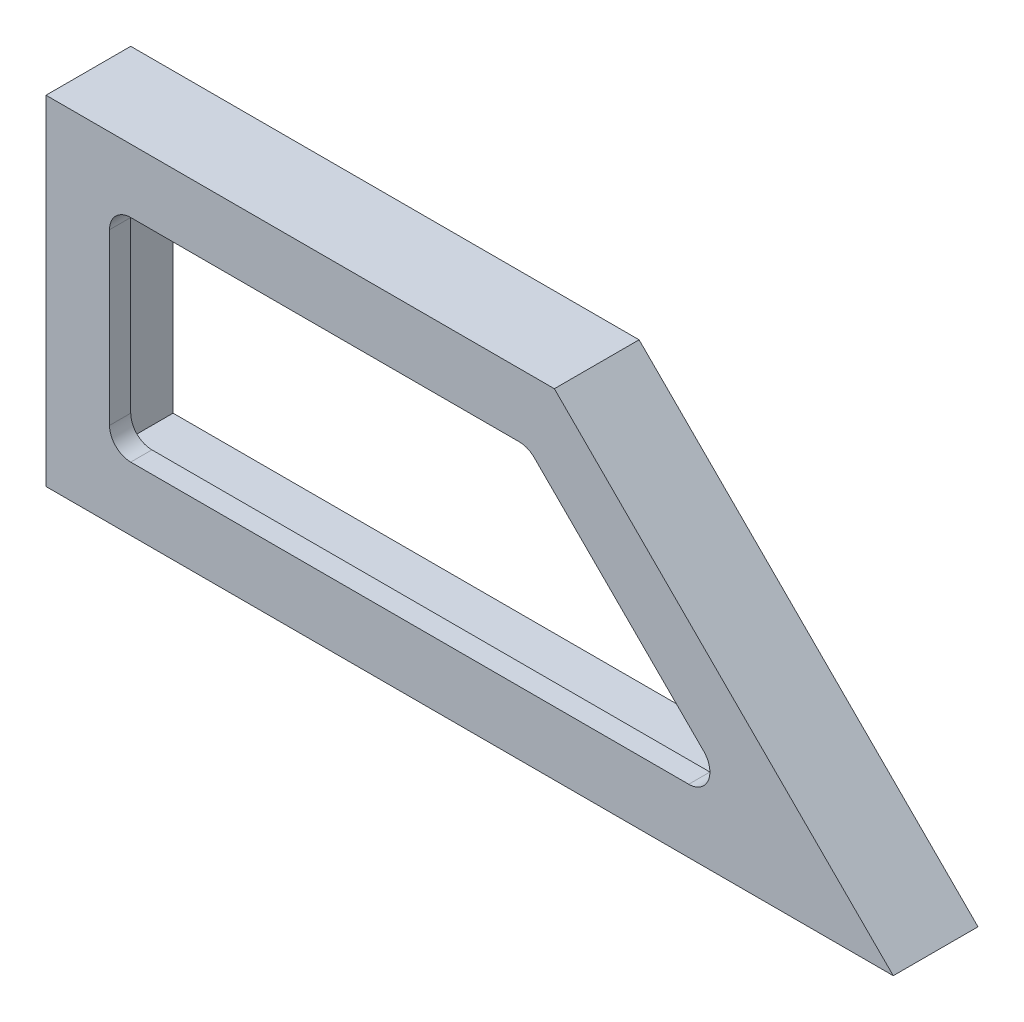
ISO-10303-21;
HEADER;
FILE_DESCRIPTION(('STEP AP214'),'2;1');
FILE_NAME('part.step','',(''),(''),'','','');
FILE_SCHEMA(('AUTOMOTIVE_DESIGN { 1 0 10303 214 1 1 1 1 }'));
ENDSEC;
DATA;
#1=APPLICATION_CONTEXT('core data for automotive mechanical design processes');
#2=APPLICATION_PROTOCOL_DEFINITION('international standard','automotive_design',2000,#1);
#3=PRODUCT_CONTEXT('',#1,'mechanical');
#4=PRODUCT('Part','Part','',(#3));
#5=PRODUCT_RELATED_PRODUCT_CATEGORY('part','',(#4));
#6=PRODUCT_DEFINITION_FORMATION('','',#4);
#7=PRODUCT_DEFINITION_CONTEXT('part definition',#1,'design');
#8=PRODUCT_DEFINITION('design','',#6,#7);
#9=PRODUCT_DEFINITION_SHAPE('','',#8);
#10=(LENGTH_UNIT() NAMED_UNIT(*) SI_UNIT(.MILLI.,.METRE.));
#11=(NAMED_UNIT(*) PLANE_ANGLE_UNIT() SI_UNIT($,.RADIAN.));
#12=(NAMED_UNIT(*) SI_UNIT($,.STERADIAN.) SOLID_ANGLE_UNIT());
#13=UNCERTAINTY_MEASURE_WITH_UNIT(LENGTH_MEASURE(1.E-05),#10,'distance_accuracy_value','');
#14=(GEOMETRIC_REPRESENTATION_CONTEXT(3) GLOBAL_UNCERTAINTY_ASSIGNED_CONTEXT((#13)) GLOBAL_UNIT_ASSIGNED_CONTEXT((#10,
#11,#12)) REPRESENTATION_CONTEXT('',''));
#15=CARTESIAN_POINT('',(0.,0.,0.));
#16=DIRECTION('',(0.,0.,1.));
#17=DIRECTION('',(1.,0.,0.));
#18=AXIS2_PLACEMENT_3D('',#15,#16,#17);
#19=CARTESIAN_POINT('',(0.,8.,2.));
#20=DIRECTION('',(-0.707106781186548,-0.707106781186547,0.));
#21=DIRECTION('',(0.707106781186547,-0.707106781186548,0.));
#22=AXIS2_PLACEMENT_3D('',#19,#20,#21);
#23=PLANE('',#22);
#24=DIRECTION('',(-0.707106781186547,0.707106781186548,0.));
#25=VECTOR('',#24,1.);
#26=CARTESIAN_POINT('',(0.,8.,0.));
#27=LINE('',#26,#25);
#28=CARTESIAN_POINT('',(8.,0.,0.));
#29=VERTEX_POINT('',#28);
#30=CARTESIAN_POINT('',(0.,8.,0.));
#31=VERTEX_POINT('',#30);
#32=EDGE_CURVE('E209',#29,#31,#27,.T.);
#33=ORIENTED_EDGE('',*,*,#32,.T.);
#34=DIRECTION('',(0.,0.,-1.));
#35=VECTOR('',#34,1.);
#36=CARTESIAN_POINT('',(0.,8.,2.));
#37=LINE('',#36,#35);
#38=CARTESIAN_POINT('',(0.,8.,2.));
#39=VERTEX_POINT('',#38);
#40=EDGE_CURVE('E233',#39,#31,#37,.T.);
#41=ORIENTED_EDGE('',*,*,#40,.F.);
#42=DIRECTION('',(-0.707106781186547,0.707106781186548,0.));
#43=VECTOR('',#42,1.);
#44=CARTESIAN_POINT('',(0.,8.,2.));
#45=LINE('',#44,#43);
#46=CARTESIAN_POINT('',(8.,0.,2.));
#47=VERTEX_POINT('',#46);
#48=EDGE_CURVE('E213',#47,#39,#45,.T.);
#49=ORIENTED_EDGE('',*,*,#48,.F.);
#50=DIRECTION('',(0.,0.,-1.));
#51=VECTOR('',#50,1.);
#52=CARTESIAN_POINT('',(8.,0.,2.));
#53=LINE('',#52,#51);
#54=EDGE_CURVE('E236',#47,#29,#53,.T.);
#55=ORIENTED_EDGE('',*,*,#54,.T.);
#56=EDGE_LOOP('',(#33,#41,#49,#55));
#57=FACE_BOUND('',#56,.T.);
#58=ADVANCED_FACE('F33',(#57),#23,.F.);
#59=CARTESIAN_POINT('',(0.,8.,2.));
#60=DIRECTION('',(0.,-1.,0.));
#61=DIRECTION('',(1.,0.,0.));
#62=AXIS2_PLACEMENT_3D('',#59,#60,#61);
#63=PLANE('',#62);
#64=DIRECTION('',(-1.,0.,0.));
#65=VECTOR('',#64,1.);
#66=CARTESIAN_POINT('',(0.,8.,0.));
#67=LINE('',#66,#65);
#68=CARTESIAN_POINT('',(-12.,8.,0.));
#69=VERTEX_POINT('',#68);
#70=EDGE_CURVE('E223',#31,#69,#67,.T.);
#71=ORIENTED_EDGE('',*,*,#70,.T.);
#72=DIRECTION('',(0.,0.,-1.));
#73=VECTOR('',#72,1.);
#74=CARTESIAN_POINT('',(-12.,8.,2.));
#75=LINE('',#74,#73);
#76=CARTESIAN_POINT('',(-12.,8.,2.));
#77=VERTEX_POINT('',#76);
#78=EDGE_CURVE('E230',#77,#69,#75,.T.);
#79=ORIENTED_EDGE('',*,*,#78,.F.);
#80=DIRECTION('',(-1.,0.,0.));
#81=VECTOR('',#80,1.);
#82=CARTESIAN_POINT('',(0.,8.,2.));
#83=LINE('',#82,#81);
#84=EDGE_CURVE('E216',#39,#77,#83,.T.);
#85=ORIENTED_EDGE('',*,*,#84,.F.);
#86=ORIENTED_EDGE('',*,*,#40,.T.);
#87=EDGE_LOOP('',(#71,#79,#85,#86));
#88=FACE_BOUND('',#87,.T.);
#89=ADVANCED_FACE('F291',(#88),#63,.F.);
#90=CARTESIAN_POINT('',(-12.,0.,2.));
#91=DIRECTION('',(1.,0.,0.));
#92=DIRECTION('',(0.,0.,-1.));
#93=AXIS2_PLACEMENT_3D('',#90,#91,#92);
#94=PLANE('',#93);
#95=DIRECTION('',(0.,-1.,0.));
#96=VECTOR('',#95,1.);
#97=CARTESIAN_POINT('',(-12.,0.,0.));
#98=LINE('',#97,#96);
#99=CARTESIAN_POINT('',(-12.,0.,0.));
#100=VERTEX_POINT('',#99);
#101=EDGE_CURVE('E225',#69,#100,#98,.T.);
#102=ORIENTED_EDGE('',*,*,#101,.T.);
#103=DIRECTION('',(0.,0.,-1.));
#104=VECTOR('',#103,1.);
#105=CARTESIAN_POINT('',(-12.,0.,2.));
#106=LINE('',#105,#104);
#107=CARTESIAN_POINT('',(-12.,0.,2.));
#108=VERTEX_POINT('',#107);
#109=EDGE_CURVE('E221',#108,#100,#106,.T.);
#110=ORIENTED_EDGE('',*,*,#109,.F.);
#111=DIRECTION('',(0.,-1.,0.));
#112=VECTOR('',#111,1.);
#113=CARTESIAN_POINT('',(-12.,0.,2.));
#114=LINE('',#113,#112);
#115=EDGE_CURVE('E218',#77,#108,#114,.T.);
#116=ORIENTED_EDGE('',*,*,#115,.F.);
#117=ORIENTED_EDGE('',*,*,#78,.T.);
#118=EDGE_LOOP('',(#102,#110,#116,#117));
#119=FACE_BOUND('',#118,.T.);
#120=ADVANCED_FACE('F297',(#119),#94,.F.);
#121=CARTESIAN_POINT('',(0.,0.,2.));
#122=DIRECTION('',(0.,1.,0.));
#123=DIRECTION('',(-1.,0.,0.));
#124=AXIS2_PLACEMENT_3D('',#121,#122,#123);
#125=PLANE('',#124);
#126=DIRECTION('',(1.,0.,0.));
#127=VECTOR('',#126,1.);
#128=CARTESIAN_POINT('',(0.,0.,0.));
#129=LINE('',#128,#127);
#130=EDGE_CURVE('E214',#100,#29,#129,.T.);
#131=ORIENTED_EDGE('',*,*,#130,.T.);
#132=ORIENTED_EDGE('',*,*,#54,.F.);
#133=DIRECTION('',(1.,0.,0.));
#134=VECTOR('',#133,1.);
#135=CARTESIAN_POINT('',(8.,0.,2.));
#136=LINE('',#135,#134);
#137=EDGE_CURVE('E210',#108,#47,#136,.T.);
#138=ORIENTED_EDGE('',*,*,#137,.F.);
#139=ORIENTED_EDGE('',*,*,#109,.T.);
#140=EDGE_LOOP('',(#131,#132,#138,#139));
#141=FACE_BOUND('',#140,.T.);
#142=ADVANCED_FACE('F341',(#141),#125,.F.);
#143=CARTESIAN_POINT('',(0.,0.,2.));
#144=DIRECTION('',(0.,0.,-1.));
#145=DIRECTION('',(-1.,0.,0.));
#146=AXIS2_PLACEMENT_3D('',#143,#144,#145);
#147=PLANE('',#146);
#148=DIRECTION('',(1.,0.,0.));
#149=VECTOR('',#148,1.);
#150=CARTESIAN_POINT('',(4.37867965644036,1.5,2.));
#151=LINE('',#150,#149);
#152=CARTESIAN_POINT('',(-10.,1.5,2.));
#153=VERTEX_POINT('',#152);
#154=CARTESIAN_POINT('',(3.17157287525381,1.5,2.));
#155=VERTEX_POINT('',#154);
#156=EDGE_CURVE('E201',#153,#155,#151,.T.);
#157=ORIENTED_EDGE('',*,*,#156,.F.);
#158=CARTESIAN_POINT('',(-10.,2.,2.));
#159=DIRECTION('',(0.,0.,-1.));
#160=DIRECTION('',(-1.,0.,0.));
#161=AXIS2_PLACEMENT_3D('',#158,#159,#160);
#162=CIRCLE('',#161,0.5);
#163=CARTESIAN_POINT('',(-10.5,2.,2.));
#164=VERTEX_POINT('',#163);
#165=EDGE_CURVE('E261',#153,#164,#162,.T.);
#166=ORIENTED_EDGE('',*,*,#165,.T.);
#167=DIRECTION('',(0.,-1.,0.));
#168=VECTOR('',#167,1.);
#169=CARTESIAN_POINT('',(-10.5,6.5,2.));
#170=LINE('',#169,#168);
#171=CARTESIAN_POINT('',(-10.5,6.,2.));
#172=VERTEX_POINT('',#171);
#173=EDGE_CURVE('E198',#172,#164,#170,.T.);
#174=ORIENTED_EDGE('',*,*,#173,.F.);
#175=CARTESIAN_POINT('',(-10.,6.,2.));
#176=DIRECTION('',(0.,0.,-1.));
#177=DIRECTION('',(-1.,0.,0.));
#178=AXIS2_PLACEMENT_3D('',#175,#176,#177);
#179=CIRCLE('',#178,0.5);
#180=CARTESIAN_POINT('',(-10.,6.5,2.));
#181=VERTEX_POINT('',#180);
#182=EDGE_CURVE('E41',#172,#181,#179,.T.);
#183=ORIENTED_EDGE('',*,*,#182,.T.);
#184=DIRECTION('',(-1.,0.,0.));
#185=VECTOR('',#184,1.);
#186=CARTESIAN_POINT('',(-10.5,6.5,2.));
#187=LINE('',#186,#185);
#188=CARTESIAN_POINT('',(-0.82842712474619,6.5,2.));
#189=VERTEX_POINT('',#188);
#190=EDGE_CURVE('E207',#189,#181,#187,.T.);
#191=ORIENTED_EDGE('',*,*,#190,.F.);
#192=CARTESIAN_POINT('',(-0.82842712474619,6.,2.));
#193=DIRECTION('',(0.,0.,-1.));
#194=DIRECTION('',(-1.,0.,0.));
#195=AXIS2_PLACEMENT_3D('',#192,#193,#194);
#196=CIRCLE('',#195,0.5);
#197=CARTESIAN_POINT('',(-0.474873734152917,6.35355339059327,2.));
#198=VERTEX_POINT('',#197);
#199=EDGE_CURVE('E55',#189,#198,#196,.T.);
#200=ORIENTED_EDGE('',*,*,#199,.T.);
#201=DIRECTION('',(-0.707106781186547,0.707106781186547,0.));
#202=VECTOR('',#201,1.);
#203=CARTESIAN_POINT('',(-0.621320343559644,6.5,2.));
#204=LINE('',#203,#202);
#205=CARTESIAN_POINT('',(3.52512626584709,2.35355339059327,2.));
#206=VERTEX_POINT('',#205);
#207=EDGE_CURVE('E204',#206,#198,#204,.T.);
#208=ORIENTED_EDGE('',*,*,#207,.F.);
#209=CARTESIAN_POINT('',(3.17157287525381,2.,2.));
#210=DIRECTION('',(0.,0.,-1.));
#211=DIRECTION('',(-1.,0.,0.));
#212=AXIS2_PLACEMENT_3D('',#209,#210,#211);
#213=CIRCLE('',#212,0.5);
#214=EDGE_CURVE('E265',#206,#155,#213,.T.);
#215=ORIENTED_EDGE('',*,*,#214,.T.);
#216=EDGE_LOOP('',(#157,#166,#174,#183,#191,#200,#208,#215));
#217=FACE_BOUND('',#216,.T.);
#218=ORIENTED_EDGE('',*,*,#137,.T.);
#219=ORIENTED_EDGE('',*,*,#48,.T.);
#220=ORIENTED_EDGE('',*,*,#84,.T.);
#221=ORIENTED_EDGE('',*,*,#115,.T.);
#222=EDGE_LOOP('',(#218,#219,#220,#221));
#223=FACE_BOUND('',#222,.T.);
#224=ADVANCED_FACE('F322',(#217,#223),#147,.F.);
#225=CARTESIAN_POINT('',(0.,0.,0.));
#226=DIRECTION('',(0.,0.,-1.));
#227=DIRECTION('',(-1.,0.,0.));
#228=AXIS2_PLACEMENT_3D('',#225,#226,#227);
#229=PLANE('',#228);
#230=DIRECTION('',(0.,1.,0.));
#231=VECTOR('',#230,1.);
#232=CARTESIAN_POINT('',(-11.,7.,0.));
#233=LINE('',#232,#231);
#234=CARTESIAN_POINT('',(-11.,0.999999999999999,0.));
#235=VERTEX_POINT('',#234);
#236=CARTESIAN_POINT('',(-11.,7.,0.));
#237=VERTEX_POINT('',#236);
#238=EDGE_CURVE('E152',#235,#237,#233,.T.);
#239=ORIENTED_EDGE('',*,*,#238,.F.);
#240=DIRECTION('',(-1.,0.,0.));
#241=VECTOR('',#240,1.);
#242=CARTESIAN_POINT('',(-11.,0.999999999999999,0.));
#243=LINE('',#242,#241);
#244=CARTESIAN_POINT('',(5.58578643762691,0.999999999999997,0.));
#245=VERTEX_POINT('',#244);
#246=EDGE_CURVE('E171',#245,#235,#243,.T.);
#247=ORIENTED_EDGE('',*,*,#246,.F.);
#248=DIRECTION('',(0.707106781186547,-0.707106781186547,0.));
#249=VECTOR('',#248,1.);
#250=CARTESIAN_POINT('',(-0.414213562373096,7.,0.));
#251=LINE('',#250,#249);
#252=CARTESIAN_POINT('',(-0.414213562373096,7.,0.));
#253=VERTEX_POINT('',#252);
#254=EDGE_CURVE('E174',#253,#245,#251,.T.);
#255=ORIENTED_EDGE('',*,*,#254,.F.);
#256=DIRECTION('',(1.,0.,0.));
#257=VECTOR('',#256,1.);
#258=CARTESIAN_POINT('',(-11.,7.,0.));
#259=LINE('',#258,#257);
#260=EDGE_CURVE('E180',#237,#253,#259,.T.);
#261=ORIENTED_EDGE('',*,*,#260,.F.);
#262=EDGE_LOOP('',(#239,#247,#255,#261));
#263=FACE_BOUND('',#262,.T.);
#264=ORIENTED_EDGE('',*,*,#32,.F.);
#265=ORIENTED_EDGE('',*,*,#130,.F.);
#266=ORIENTED_EDGE('',*,*,#101,.F.);
#267=ORIENTED_EDGE('',*,*,#70,.F.);
#268=EDGE_LOOP('',(#264,#265,#266,#267));
#269=FACE_BOUND('',#268,.T.);
#270=ADVANCED_FACE('F328',(#263,#269),#229,.T.);
#271=CARTESIAN_POINT('',(-10.5,6.5,0.));
#272=DIRECTION('',(-1.,0.,0.));
#273=DIRECTION('',(0.,0.,1.));
#274=AXIS2_PLACEMENT_3D('',#271,#272,#273);
#275=PLANE('',#274);
#276=ORIENTED_EDGE('',*,*,#173,.T.);
#277=DIRECTION('',(0.,0.,1.));
#278=VECTOR('',#277,1.);
#279=CARTESIAN_POINT('',(-10.5,2.,1.5));
#280=LINE('',#279,#278);
#281=CARTESIAN_POINT('',(-10.5,2.,1.5));
#282=VERTEX_POINT('',#281);
#283=EDGE_CURVE('E250',#164,#282,#280,.F.);
#284=ORIENTED_EDGE('',*,*,#283,.T.);
#285=DIRECTION('',(0.,1.,0.));
#286=VECTOR('',#285,1.);
#287=CARTESIAN_POINT('',(-10.5,6.5,1.5));
#288=LINE('',#287,#286);
#289=CARTESIAN_POINT('',(-10.5,6.,1.5));
#290=VERTEX_POINT('',#289);
#291=EDGE_CURVE('E195',#282,#290,#288,.T.);
#292=ORIENTED_EDGE('',*,*,#291,.T.);
#293=DIRECTION('',(0.,0.,1.));
#294=VECTOR('',#293,1.);
#295=CARTESIAN_POINT('',(-10.5,6.,2.));
#296=LINE('',#295,#294);
#297=EDGE_CURVE('E247',#290,#172,#296,.T.);
#298=ORIENTED_EDGE('',*,*,#297,.T.);
#299=EDGE_LOOP('',(#276,#284,#292,#298));
#300=FACE_BOUND('',#299,.T.);
#301=ADVANCED_FACE('F326',(#300),#275,.F.);
#302=CARTESIAN_POINT('',(-10.5,6.5,0.));
#303=DIRECTION('',(0.,1.,0.));
#304=DIRECTION('',(0.,0.,1.));
#305=AXIS2_PLACEMENT_3D('',#302,#303,#304);
#306=PLANE('',#305);
#307=DIRECTION('',(1.,0.,0.));
#308=VECTOR('',#307,1.);
#309=CARTESIAN_POINT('',(-10.5,6.5,1.5));
#310=LINE('',#309,#308);
#311=CARTESIAN_POINT('',(-10.,6.5,1.5));
#312=VERTEX_POINT('',#311);
#313=CARTESIAN_POINT('',(-0.82842712474619,6.5,1.5));
#314=VERTEX_POINT('',#313);
#315=EDGE_CURVE('E192',#312,#314,#310,.T.);
#316=ORIENTED_EDGE('',*,*,#315,.T.);
#317=DIRECTION('',(0.,0.,1.));
#318=VECTOR('',#317,1.);
#319=CARTESIAN_POINT('',(-0.82842712474619,6.5,2.));
#320=LINE('',#319,#318);
#321=EDGE_CURVE('E259',#314,#189,#320,.T.);
#322=ORIENTED_EDGE('',*,*,#321,.T.);
#323=ORIENTED_EDGE('',*,*,#190,.T.);
#324=DIRECTION('',(0.,0.,1.));
#325=VECTOR('',#324,1.);
#326=CARTESIAN_POINT('',(-10.,6.5,1.5));
#327=LINE('',#326,#325);
#328=EDGE_CURVE('E257',#181,#312,#327,.F.);
#329=ORIENTED_EDGE('',*,*,#328,.T.);
#330=EDGE_LOOP('',(#316,#322,#323,#329));
#331=FACE_BOUND('',#330,.T.);
#332=ADVANCED_FACE('F277',(#331),#306,.F.);
#333=CARTESIAN_POINT('',(-0.621320343559644,6.5,0.));
#334=DIRECTION('',(0.707106781186547,0.707106781186547,0.));
#335=DIRECTION('',(-0.707106781186548,0.707106781186548,0.));
#336=AXIS2_PLACEMENT_3D('',#333,#334,#335);
#337=PLANE('',#336);
#338=DIRECTION('',(0.707106781186548,-0.707106781186548,0.));
#339=VECTOR('',#338,1.);
#340=CARTESIAN_POINT('',(-0.621320343559644,6.5,1.5));
#341=LINE('',#340,#339);
#342=CARTESIAN_POINT('',(-0.474873734152917,6.35355339059327,1.5));
#343=VERTEX_POINT('',#342);
#344=CARTESIAN_POINT('',(3.52512626584709,2.35355339059327,1.5));
#345=VERTEX_POINT('',#344);
#346=EDGE_CURVE('E186',#343,#345,#341,.T.);
#347=ORIENTED_EDGE('',*,*,#346,.T.);
#348=DIRECTION('',(0.,0.,1.));
#349=VECTOR('',#348,1.);
#350=CARTESIAN_POINT('',(3.52512626584709,2.35355339059327,2.));
#351=LINE('',#350,#349);
#352=EDGE_CURVE('E254',#345,#206,#351,.T.);
#353=ORIENTED_EDGE('',*,*,#352,.T.);
#354=ORIENTED_EDGE('',*,*,#207,.T.);
#355=DIRECTION('',(0.,0.,1.));
#356=VECTOR('',#355,1.);
#357=CARTESIAN_POINT('',(-0.474873734152917,6.35355339059327,1.5));
#358=LINE('',#357,#356);
#359=EDGE_CURVE('E252',#198,#343,#358,.F.);
#360=ORIENTED_EDGE('',*,*,#359,.T.);
#361=EDGE_LOOP('',(#347,#353,#354,#360));
#362=FACE_BOUND('',#361,.T.);
#363=ADVANCED_FACE('F320',(#362),#337,.F.);
#364=CARTESIAN_POINT('',(4.37867965644036,1.5,0.));
#365=DIRECTION('',(0.,-1.,0.));
#366=DIRECTION('',(1.,0.,0.));
#367=AXIS2_PLACEMENT_3D('',#364,#365,#366);
#368=PLANE('',#367);
#369=DIRECTION('',(-1.,0.,0.));
#370=VECTOR('',#369,1.);
#371=CARTESIAN_POINT('',(4.37867965644036,1.5,1.5));
#372=LINE('',#371,#370);
#373=CARTESIAN_POINT('',(3.17157287525381,1.5,1.5));
#374=VERTEX_POINT('',#373);
#375=CARTESIAN_POINT('',(-10.,1.5,1.5));
#376=VERTEX_POINT('',#375);
#377=EDGE_CURVE('E239',#374,#376,#372,.T.);
#378=ORIENTED_EDGE('',*,*,#377,.T.);
#379=DIRECTION('',(0.,0.,1.));
#380=VECTOR('',#379,1.);
#381=CARTESIAN_POINT('',(-10.,1.5,2.));
#382=LINE('',#381,#380);
#383=EDGE_CURVE('E244',#376,#153,#382,.T.);
#384=ORIENTED_EDGE('',*,*,#383,.T.);
#385=ORIENTED_EDGE('',*,*,#156,.T.);
#386=DIRECTION('',(0.,0.,1.));
#387=VECTOR('',#386,1.);
#388=CARTESIAN_POINT('',(3.17157287525381,1.5,1.5));
#389=LINE('',#388,#387);
#390=EDGE_CURVE('E242',#155,#374,#389,.F.);
#391=ORIENTED_EDGE('',*,*,#390,.T.);
#392=EDGE_LOOP('',(#378,#384,#385,#391));
#393=FACE_BOUND('',#392,.T.);
#394=ADVANCED_FACE('F315',(#393),#368,.F.);
#395=CARTESIAN_POINT('',(0.,0.,1.5));
#396=DIRECTION('',(0.,0.,1.));
#397=DIRECTION('',(1.,0.,0.));
#398=AXIS2_PLACEMENT_3D('',#395,#396,#397);
#399=PLANE('',#398);
#400=DIRECTION('',(0.,1.,0.));
#401=VECTOR('',#400,1.);
#402=CARTESIAN_POINT('',(-11.,7.,1.5));
#403=LINE('',#402,#401);
#404=CARTESIAN_POINT('',(-11.,0.999999999999999,1.5));
#405=VERTEX_POINT('',#404);
#406=CARTESIAN_POINT('',(-11.,7.,1.5));
#407=VERTEX_POINT('',#406);
#408=EDGE_CURVE('E150',#405,#407,#403,.T.);
#409=ORIENTED_EDGE('',*,*,#408,.T.);
#410=DIRECTION('',(1.,0.,0.));
#411=VECTOR('',#410,1.);
#412=CARTESIAN_POINT('',(-11.,7.,1.5));
#413=LINE('',#412,#411);
#414=CARTESIAN_POINT('',(-0.414213562373096,7.,1.5));
#415=VERTEX_POINT('',#414);
#416=EDGE_CURVE('E160',#407,#415,#413,.T.);
#417=ORIENTED_EDGE('',*,*,#416,.T.);
#418=DIRECTION('',(0.707106781186547,-0.707106781186547,0.));
#419=VECTOR('',#418,1.);
#420=CARTESIAN_POINT('',(-0.414213562373096,7.,1.5));
#421=LINE('',#420,#419);
#422=CARTESIAN_POINT('',(5.58578643762691,0.999999999999997,1.5));
#423=VERTEX_POINT('',#422);
#424=EDGE_CURVE('E165',#415,#423,#421,.T.);
#425=ORIENTED_EDGE('',*,*,#424,.T.);
#426=DIRECTION('',(-1.,0.,0.));
#427=VECTOR('',#426,1.);
#428=CARTESIAN_POINT('',(5.58578643762691,0.999999999999997,1.5));
#429=LINE('',#428,#427);
#430=EDGE_CURVE('E157',#423,#405,#429,.T.);
#431=ORIENTED_EDGE('',*,*,#430,.T.);
#432=EDGE_LOOP('',(#409,#417,#425,#431));
#433=FACE_BOUND('',#432,.T.);
#434=ORIENTED_EDGE('',*,*,#377,.F.);
#435=CARTESIAN_POINT('',(3.17157287525381,2.,1.5));
#436=DIRECTION('',(0.,0.,1.));
#437=DIRECTION('',(1.,0.,0.));
#438=AXIS2_PLACEMENT_3D('',#435,#436,#437);
#439=CIRCLE('',#438,0.5);
#440=EDGE_CURVE('E267',#374,#345,#439,.T.);
#441=ORIENTED_EDGE('',*,*,#440,.T.);
#442=ORIENTED_EDGE('',*,*,#346,.F.);
#443=CARTESIAN_POINT('',(-0.82842712474619,6.,1.5));
#444=DIRECTION('',(0.,0.,1.));
#445=DIRECTION('',(1.,0.,0.));
#446=AXIS2_PLACEMENT_3D('',#443,#444,#445);
#447=CIRCLE('',#446,0.5);
#448=EDGE_CURVE('E270',#343,#314,#447,.T.);
#449=ORIENTED_EDGE('',*,*,#448,.T.);
#450=ORIENTED_EDGE('',*,*,#315,.F.);
#451=CARTESIAN_POINT('',(-10.,6.,1.5));
#452=DIRECTION('',(0.,0.,1.));
#453=DIRECTION('',(1.,0.,0.));
#454=AXIS2_PLACEMENT_3D('',#451,#452,#453);
#455=CIRCLE('',#454,0.5);
#456=EDGE_CURVE('E11',#312,#290,#455,.T.);
#457=ORIENTED_EDGE('',*,*,#456,.T.);
#458=ORIENTED_EDGE('',*,*,#291,.F.);
#459=CARTESIAN_POINT('',(-10.,2.,1.5));
#460=DIRECTION('',(0.,0.,1.));
#461=DIRECTION('',(1.,0.,0.));
#462=AXIS2_PLACEMENT_3D('',#459,#460,#461);
#463=CIRCLE('',#462,0.5);
#464=EDGE_CURVE('E263',#282,#376,#463,.T.);
#465=ORIENTED_EDGE('',*,*,#464,.T.);
#466=EDGE_LOOP('',(#434,#441,#442,#449,#450,#457,#458,#465));
#467=FACE_BOUND('',#466,.T.);
#468=ADVANCED_FACE('F167',(#433,#467),#399,.F.);
#469=CARTESIAN_POINT('',(-11.,7.,1.5));
#470=DIRECTION('',(-1.,0.,0.));
#471=DIRECTION('',(0.,0.,1.));
#472=AXIS2_PLACEMENT_3D('',#469,#470,#471);
#473=PLANE('',#472);
#474=ORIENTED_EDGE('',*,*,#238,.T.);
#475=DIRECTION('',(0.,0.,-1.));
#476=VECTOR('',#475,1.);
#477=CARTESIAN_POINT('',(-11.,7.,1.5));
#478=LINE('',#477,#476);
#479=EDGE_CURVE('E146',#407,#237,#478,.T.);
#480=ORIENTED_EDGE('',*,*,#479,.F.);
#481=ORIENTED_EDGE('',*,*,#408,.F.);
#482=DIRECTION('',(0.,0.,-1.));
#483=VECTOR('',#482,1.);
#484=CARTESIAN_POINT('',(-11.,0.999999999999999,1.5));
#485=LINE('',#484,#483);
#486=EDGE_CURVE('E184',#405,#235,#485,.T.);
#487=ORIENTED_EDGE('',*,*,#486,.T.);
#488=EDGE_LOOP('',(#474,#480,#481,#487));
#489=FACE_BOUND('',#488,.T.);
#490=ADVANCED_FACE('F148',(#489),#473,.F.);
#491=CARTESIAN_POINT('',(-11.,0.999999999999999,1.5));
#492=DIRECTION('',(0.,-1.,0.));
#493=DIRECTION('',(1.,0.,0.));
#494=AXIS2_PLACEMENT_3D('',#491,#492,#493);
#495=PLANE('',#494);
#496=ORIENTED_EDGE('',*,*,#246,.T.);
#497=ORIENTED_EDGE('',*,*,#486,.F.);
#498=ORIENTED_EDGE('',*,*,#430,.F.);
#499=DIRECTION('',(0.,0.,-1.));
#500=VECTOR('',#499,1.);
#501=CARTESIAN_POINT('',(5.58578643762691,0.999999999999997,1.5));
#502=LINE('',#501,#500);
#503=EDGE_CURVE('E187',#423,#245,#502,.T.);
#504=ORIENTED_EDGE('',*,*,#503,.T.);
#505=EDGE_LOOP('',(#496,#497,#498,#504));
#506=FACE_BOUND('',#505,.T.);
#507=ADVANCED_FACE('F417',(#506),#495,.F.);
#508=CARTESIAN_POINT('',(-0.414213562373096,7.,1.5));
#509=DIRECTION('',(0.707106781186548,0.707106781186548,0.));
#510=DIRECTION('',(-0.707106781186548,0.707106781186548,0.));
#511=AXIS2_PLACEMENT_3D('',#508,#509,#510);
#512=PLANE('',#511);
#513=ORIENTED_EDGE('',*,*,#254,.T.);
#514=ORIENTED_EDGE('',*,*,#503,.F.);
#515=ORIENTED_EDGE('',*,*,#424,.F.);
#516=DIRECTION('',(0.,0.,-1.));
#517=VECTOR('',#516,1.);
#518=CARTESIAN_POINT('',(-0.414213562373096,7.,1.5));
#519=LINE('',#518,#517);
#520=EDGE_CURVE('E156',#415,#253,#519,.T.);
#521=ORIENTED_EDGE('',*,*,#520,.T.);
#522=EDGE_LOOP('',(#513,#514,#515,#521));
#523=FACE_BOUND('',#522,.T.);
#524=ADVANCED_FACE('F307',(#523),#512,.F.);
#525=CARTESIAN_POINT('',(-11.,7.,1.5));
#526=DIRECTION('',(0.,1.,0.));
#527=DIRECTION('',(-1.,0.,0.));
#528=AXIS2_PLACEMENT_3D('',#525,#526,#527);
#529=PLANE('',#528);
#530=ORIENTED_EDGE('',*,*,#260,.T.);
#531=ORIENTED_EDGE('',*,*,#520,.F.);
#532=ORIENTED_EDGE('',*,*,#416,.F.);
#533=ORIENTED_EDGE('',*,*,#479,.T.);
#534=EDGE_LOOP('',(#530,#531,#532,#533));
#535=FACE_BOUND('',#534,.T.);
#536=ADVANCED_FACE('F161',(#535),#529,.F.);
#537=CARTESIAN_POINT('',(-10.,2.,0.));
#538=DIRECTION('',(0.,0.,-1.));
#539=DIRECTION('',(-1.,0.,0.));
#540=AXIS2_PLACEMENT_3D('',#537,#538,#539);
#541=CYLINDRICAL_SURFACE('',#540,0.5);
#542=ORIENTED_EDGE('',*,*,#464,.F.);
#543=ORIENTED_EDGE('',*,*,#283,.F.);
#544=ORIENTED_EDGE('',*,*,#165,.F.);
#545=ORIENTED_EDGE('',*,*,#383,.F.);
#546=EDGE_LOOP('',(#542,#543,#544,#545));
#547=FACE_BOUND('',#546,.T.);
#548=ADVANCED_FACE('F287',(#547),#541,.F.);
#549=CARTESIAN_POINT('',(3.17157287525381,2.,0.));
#550=DIRECTION('',(0.,0.,-1.));
#551=DIRECTION('',(-1.,0.,0.));
#552=AXIS2_PLACEMENT_3D('',#549,#550,#551);
#553=CYLINDRICAL_SURFACE('',#552,0.5);
#554=ORIENTED_EDGE('',*,*,#440,.F.);
#555=ORIENTED_EDGE('',*,*,#390,.F.);
#556=ORIENTED_EDGE('',*,*,#214,.F.);
#557=ORIENTED_EDGE('',*,*,#352,.F.);
#558=EDGE_LOOP('',(#554,#555,#556,#557));
#559=FACE_BOUND('',#558,.T.);
#560=ADVANCED_FACE('F281',(#559),#553,.F.);
#561=CARTESIAN_POINT('',(-0.82842712474619,6.,0.));
#562=DIRECTION('',(0.,0.,-1.));
#563=DIRECTION('',(-1.,0.,0.));
#564=AXIS2_PLACEMENT_3D('',#561,#562,#563);
#565=CYLINDRICAL_SURFACE('',#564,0.5);
#566=ORIENTED_EDGE('',*,*,#448,.F.);
#567=ORIENTED_EDGE('',*,*,#359,.F.);
#568=ORIENTED_EDGE('',*,*,#199,.F.);
#569=ORIENTED_EDGE('',*,*,#321,.F.);
#570=EDGE_LOOP('',(#566,#567,#568,#569));
#571=FACE_BOUND('',#570,.T.);
#572=ADVANCED_FACE('F279',(#571),#565,.F.);
#573=CARTESIAN_POINT('',(-10.,6.,0.));
#574=DIRECTION('',(0.,0.,-1.));
#575=DIRECTION('',(-1.,0.,0.));
#576=AXIS2_PLACEMENT_3D('',#573,#574,#575);
#577=CYLINDRICAL_SURFACE('',#576,0.5);
#578=ORIENTED_EDGE('',*,*,#456,.F.);
#579=ORIENTED_EDGE('',*,*,#328,.F.);
#580=ORIENTED_EDGE('',*,*,#182,.F.);
#581=ORIENTED_EDGE('',*,*,#297,.F.);
#582=EDGE_LOOP('',(#578,#579,#580,#581));
#583=FACE_BOUND('',#582,.T.);
#584=ADVANCED_FACE('F35',(#583),#577,.F.);
#585=CLOSED_SHELL('',(#58,#89,#120,#142,#224,#270,#301,#332,#363,#394,#468,#490,#507,#524,#536,
#548,#560,#572,#584));
#586=MANIFOLD_SOLID_BREP('B2',#585);
#587=ADVANCED_BREP_SHAPE_REPRESENTATION('',(#18,#586),#14);
#588=SHAPE_DEFINITION_REPRESENTATION(#9,#587);
ENDSEC;
END-ISO-10303-21;
